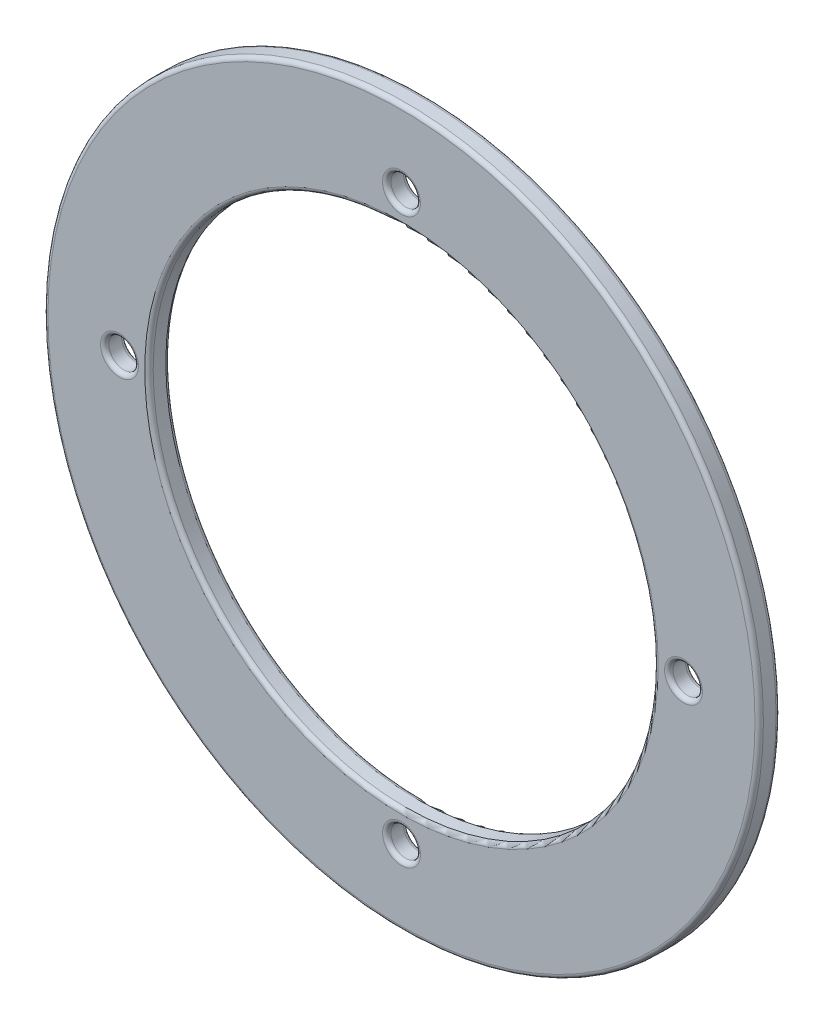
ISO-10303-21;
HEADER;
FILE_DESCRIPTION(('STEP AP214'),'2;1');
FILE_NAME('part.step','',(''),(''),'','','');
FILE_SCHEMA(('AUTOMOTIVE_DESIGN { 1 0 10303 214 1 1 1 1 }'));
ENDSEC;
DATA;
#1=APPLICATION_CONTEXT('core data for automotive mechanical design processes');
#2=APPLICATION_PROTOCOL_DEFINITION('international standard','automotive_design',2000,#1);
#3=PRODUCT_CONTEXT('',#1,'mechanical');
#4=PRODUCT('Part','Part','',(#3));
#5=PRODUCT_RELATED_PRODUCT_CATEGORY('part','',(#4));
#6=PRODUCT_DEFINITION_FORMATION('','',#4);
#7=PRODUCT_DEFINITION_CONTEXT('part definition',#1,'design');
#8=PRODUCT_DEFINITION('design','',#6,#7);
#9=PRODUCT_DEFINITION_SHAPE('','',#8);
#10=(LENGTH_UNIT() NAMED_UNIT(*) SI_UNIT(.MILLI.,.METRE.));
#11=(NAMED_UNIT(*) PLANE_ANGLE_UNIT() SI_UNIT($,.RADIAN.));
#12=(NAMED_UNIT(*) SI_UNIT($,.STERADIAN.) SOLID_ANGLE_UNIT());
#13=UNCERTAINTY_MEASURE_WITH_UNIT(LENGTH_MEASURE(1.E-05),#10,'distance_accuracy_value','');
#14=(GEOMETRIC_REPRESENTATION_CONTEXT(3) GLOBAL_UNCERTAINTY_ASSIGNED_CONTEXT((#13)) GLOBAL_UNIT_ASSIGNED_CONTEXT((#10,
#11,#12)) REPRESENTATION_CONTEXT('',''));
#15=CARTESIAN_POINT('',(0.,0.,0.));
#16=DIRECTION('',(0.,0.,1.));
#17=DIRECTION('',(1.,0.,0.));
#18=AXIS2_PLACEMENT_3D('',#15,#16,#17);
#19=CARTESIAN_POINT('',(0.,0.,2.5));
#20=DIRECTION('',(0.,0.,1.));
#21=DIRECTION('',(1.,0.,0.));
#22=AXIS2_PLACEMENT_3D('',#19,#20,#21);
#23=PLANE('',#22);
#24=CARTESIAN_POINT('',(0.,0.,2.5));
#25=DIRECTION('',(0.,0.,1.));
#26=DIRECTION('',(1.,0.,0.));
#27=AXIS2_PLACEMENT_3D('',#24,#25,#26);
#28=CIRCLE('',#27,30.5);
#29=CARTESIAN_POINT('',(30.5,0.,2.5));
#30=VERTEX_POINT('',#29);
#31=EDGE_CURVE('E87',#30,#30,#28,.F.);
#32=ORIENTED_EDGE('',*,*,#31,.T.);
#33=EDGE_LOOP('',(#32));
#34=FACE_BOUND('',#33,.T.);
#35=CARTESIAN_POINT('',(-33.5,0.,2.5));
#36=DIRECTION('',(0.,0.,1.));
#37=DIRECTION('',(1.,0.,0.));
#38=AXIS2_PLACEMENT_3D('',#35,#36,#37);
#39=CIRCLE('',#38,2.25000000000034);
#40=CARTESIAN_POINT('',(-31.2499999999997,0.,2.5));
#41=VERTEX_POINT('',#40);
#42=EDGE_CURVE('E90',#41,#41,#39,.F.);
#43=ORIENTED_EDGE('',*,*,#42,.T.);
#44=EDGE_LOOP('',(#43));
#45=FACE_BOUND('',#44,.T.);
#46=CARTESIAN_POINT('',(0.,-33.5,2.5));
#47=DIRECTION('',(0.,0.,1.));
#48=DIRECTION('',(1.,0.,0.));
#49=AXIS2_PLACEMENT_3D('',#46,#47,#48);
#50=CIRCLE('',#49,2.25000000000023);
#51=CARTESIAN_POINT('',(2.25000000000023,-33.5,2.5));
#52=VERTEX_POINT('',#51);
#53=EDGE_CURVE('E93',#52,#52,#50,.F.);
#54=ORIENTED_EDGE('',*,*,#53,.T.);
#55=EDGE_LOOP('',(#54));
#56=FACE_BOUND('',#55,.T.);
#57=CARTESIAN_POINT('',(33.5,0.,2.5));
#58=DIRECTION('',(0.,0.,1.));
#59=DIRECTION('',(1.,0.,0.));
#60=AXIS2_PLACEMENT_3D('',#57,#58,#59);
#61=CIRCLE('',#60,2.25000000000011);
#62=CARTESIAN_POINT('',(35.7500000000001,0.,2.5));
#63=VERTEX_POINT('',#62);
#64=EDGE_CURVE('E96',#63,#63,#61,.F.);
#65=ORIENTED_EDGE('',*,*,#64,.T.);
#66=EDGE_LOOP('',(#65));
#67=FACE_BOUND('',#66,.T.);
#68=CARTESIAN_POINT('',(0.,33.5,2.5));
#69=DIRECTION('',(0.,0.,1.));
#70=DIRECTION('',(1.,0.,0.));
#71=AXIS2_PLACEMENT_3D('',#68,#69,#70);
#72=CIRCLE('',#71,2.25);
#73=CARTESIAN_POINT('',(2.25,33.5,2.5));
#74=VERTEX_POINT('',#73);
#75=EDGE_CURVE('E99',#74,#74,#72,.F.);
#76=ORIENTED_EDGE('',*,*,#75,.T.);
#77=EDGE_LOOP('',(#76));
#78=FACE_BOUND('',#77,.T.);
#79=CARTESIAN_POINT('',(0.,0.,2.5));
#80=DIRECTION('',(0.,0.,1.));
#81=DIRECTION('',(1.,0.,0.));
#82=AXIS2_PLACEMENT_3D('',#79,#80,#81);
#83=CIRCLE('',#82,42.);
#84=CARTESIAN_POINT('',(42.,0.,2.5));
#85=VERTEX_POINT('',#84);
#86=EDGE_CURVE('E102',#85,#85,#83,.T.);
#87=ORIENTED_EDGE('',*,*,#86,.T.);
#88=EDGE_LOOP('',(#87));
#89=FACE_BOUND('',#88,.T.);
#90=ADVANCED_FACE('F31',(#34,#45,#56,#67,#78,#89),#23,.T.);
#91=CARTESIAN_POINT('',(0.,0.,0.));
#92=DIRECTION('',(0.,0.,1.));
#93=DIRECTION('',(1.,0.,0.));
#94=AXIS2_PLACEMENT_3D('',#91,#92,#93);
#95=PLANE('',#94);
#96=CARTESIAN_POINT('',(0.,0.,0.));
#97=DIRECTION('',(0.,0.,1.));
#98=DIRECTION('',(1.,0.,0.));
#99=AXIS2_PLACEMENT_3D('',#96,#97,#98);
#100=CIRCLE('',#99,30.5);
#101=CARTESIAN_POINT('',(30.5,0.,0.));
#102=VERTEX_POINT('',#101);
#103=EDGE_CURVE('E69',#102,#102,#100,.T.);
#104=ORIENTED_EDGE('',*,*,#103,.T.);
#105=EDGE_LOOP('',(#104));
#106=FACE_BOUND('',#105,.T.);
#107=CARTESIAN_POINT('',(-33.5,0.,0.));
#108=DIRECTION('',(0.,0.,1.));
#109=DIRECTION('',(1.,0.,0.));
#110=AXIS2_PLACEMENT_3D('',#107,#108,#109);
#111=CIRCLE('',#110,2.25000000000034);
#112=CARTESIAN_POINT('',(-31.2499999999997,0.,0.));
#113=VERTEX_POINT('',#112);
#114=EDGE_CURVE('E72',#113,#113,#111,.T.);
#115=ORIENTED_EDGE('',*,*,#114,.T.);
#116=EDGE_LOOP('',(#115));
#117=FACE_BOUND('',#116,.T.);
#118=CARTESIAN_POINT('',(0.,-33.5,0.));
#119=DIRECTION('',(0.,0.,1.));
#120=DIRECTION('',(1.,0.,0.));
#121=AXIS2_PLACEMENT_3D('',#118,#119,#120);
#122=CIRCLE('',#121,2.25000000000023);
#123=CARTESIAN_POINT('',(2.25000000000023,-33.5,0.));
#124=VERTEX_POINT('',#123);
#125=EDGE_CURVE('E75',#124,#124,#122,.T.);
#126=ORIENTED_EDGE('',*,*,#125,.T.);
#127=EDGE_LOOP('',(#126));
#128=FACE_BOUND('',#127,.T.);
#129=CARTESIAN_POINT('',(33.5,0.,0.));
#130=DIRECTION('',(0.,0.,1.));
#131=DIRECTION('',(1.,0.,0.));
#132=AXIS2_PLACEMENT_3D('',#129,#130,#131);
#133=CIRCLE('',#132,2.25000000000011);
#134=CARTESIAN_POINT('',(35.7500000000001,0.,0.));
#135=VERTEX_POINT('',#134);
#136=EDGE_CURVE('E78',#135,#135,#133,.T.);
#137=ORIENTED_EDGE('',*,*,#136,.T.);
#138=EDGE_LOOP('',(#137));
#139=FACE_BOUND('',#138,.T.);
#140=CARTESIAN_POINT('',(0.,33.5,0.));
#141=DIRECTION('',(0.,0.,1.));
#142=DIRECTION('',(1.,0.,0.));
#143=AXIS2_PLACEMENT_3D('',#140,#141,#142);
#144=CIRCLE('',#143,2.25);
#145=CARTESIAN_POINT('',(2.25,33.5,0.));
#146=VERTEX_POINT('',#145);
#147=EDGE_CURVE('E81',#146,#146,#144,.T.);
#148=ORIENTED_EDGE('',*,*,#147,.T.);
#149=EDGE_LOOP('',(#148));
#150=FACE_BOUND('',#149,.T.);
#151=CARTESIAN_POINT('',(0.,0.,0.));
#152=DIRECTION('',(0.,0.,1.));
#153=DIRECTION('',(1.,0.,0.));
#154=AXIS2_PLACEMENT_3D('',#151,#152,#153);
#155=CIRCLE('',#154,42.);
#156=CARTESIAN_POINT('',(42.,0.,0.));
#157=VERTEX_POINT('',#156);
#158=EDGE_CURVE('E84',#157,#157,#155,.F.);
#159=ORIENTED_EDGE('',*,*,#158,.T.);
#160=EDGE_LOOP('',(#159));
#161=FACE_BOUND('',#160,.T.);
#162=ADVANCED_FACE('F131',(#106,#117,#128,#139,#150,#161),#95,.F.);
#163=CARTESIAN_POINT('',(0.,0.,2.5));
#164=DIRECTION('',(0.,0.,-1.));
#165=DIRECTION('',(-1.,0.,0.));
#166=AXIS2_PLACEMENT_3D('',#163,#164,#165);
#167=CYLINDRICAL_SURFACE('',#166,42.5);
#168=CARTESIAN_POINT('',(0.,0.,2.));
#169=DIRECTION('',(0.,0.,1.));
#170=DIRECTION('',(1.,0.,0.));
#171=AXIS2_PLACEMENT_3D('',#168,#169,#170);
#172=CIRCLE('',#171,42.5);
#173=CARTESIAN_POINT('',(42.5,0.,2.));
#174=VERTEX_POINT('',#173);
#175=EDGE_CURVE('E10',#174,#174,#172,.F.);
#176=ORIENTED_EDGE('',*,*,#175,.T.);
#177=EDGE_LOOP('',(#176));
#178=FACE_BOUND('',#177,.T.);
#179=CARTESIAN_POINT('',(0.,0.,0.5));
#180=DIRECTION('',(0.,0.,1.));
#181=DIRECTION('',(1.,0.,0.));
#182=AXIS2_PLACEMENT_3D('',#179,#180,#181);
#183=CIRCLE('',#182,42.5);
#184=CARTESIAN_POINT('',(42.5,0.,0.5));
#185=VERTEX_POINT('',#184);
#186=EDGE_CURVE('E38',#185,#185,#183,.T.);
#187=ORIENTED_EDGE('',*,*,#186,.T.);
#188=EDGE_LOOP('',(#187));
#189=FACE_BOUND('',#188,.T.);
#190=ADVANCED_FACE('F137',(#178,#189),#167,.T.);
#191=CARTESIAN_POINT('',(0.,33.5,2.5));
#192=DIRECTION('',(0.,0.,-1.));
#193=DIRECTION('',(-1.,0.,0.));
#194=AXIS2_PLACEMENT_3D('',#191,#192,#193);
#195=CYLINDRICAL_SURFACE('',#194,1.75);
#196=CARTESIAN_POINT('',(0.,33.5,0.5));
#197=DIRECTION('',(0.,0.,1.));
#198=DIRECTION('',(1.,0.,0.));
#199=AXIS2_PLACEMENT_3D('',#196,#197,#198);
#200=CIRCLE('',#199,1.75);
#201=CARTESIAN_POINT('',(1.75,33.5,0.5));
#202=VERTEX_POINT('',#201);
#203=EDGE_CURVE('E42',#202,#202,#200,.F.);
#204=ORIENTED_EDGE('',*,*,#203,.T.);
#205=EDGE_LOOP('',(#204));
#206=FACE_BOUND('',#205,.T.);
#207=CARTESIAN_POINT('',(0.,33.5,2.));
#208=DIRECTION('',(0.,0.,1.));
#209=DIRECTION('',(1.,0.,0.));
#210=AXIS2_PLACEMENT_3D('',#207,#208,#209);
#211=CIRCLE('',#210,1.75);
#212=CARTESIAN_POINT('',(1.75,33.5,2.));
#213=VERTEX_POINT('',#212);
#214=EDGE_CURVE('E46',#213,#213,#211,.T.);
#215=ORIENTED_EDGE('',*,*,#214,.T.);
#216=EDGE_LOOP('',(#215));
#217=FACE_BOUND('',#216,.T.);
#218=ADVANCED_FACE('F142',(#206,#217),#195,.F.);
#219=CARTESIAN_POINT('',(33.5,0.,2.5));
#220=DIRECTION('',(0.,0.,-1.));
#221=DIRECTION('',(-1.,0.,0.));
#222=AXIS2_PLACEMENT_3D('',#219,#220,#221);
#223=CYLINDRICAL_SURFACE('',#222,1.75000000000011);
#224=CARTESIAN_POINT('',(33.5,0.,0.5));
#225=DIRECTION('',(0.,0.,1.));
#226=DIRECTION('',(1.,0.,0.));
#227=AXIS2_PLACEMENT_3D('',#224,#225,#226);
#228=CIRCLE('',#227,1.75000000000011);
#229=CARTESIAN_POINT('',(35.2500000000001,0.,0.5));
#230=VERTEX_POINT('',#229);
#231=EDGE_CURVE('E51',#230,#230,#228,.F.);
#232=ORIENTED_EDGE('',*,*,#231,.T.);
#233=EDGE_LOOP('',(#232));
#234=FACE_BOUND('',#233,.T.);
#235=CARTESIAN_POINT('',(33.5,0.,2.));
#236=DIRECTION('',(0.,0.,1.));
#237=DIRECTION('',(1.,0.,0.));
#238=AXIS2_PLACEMENT_3D('',#235,#236,#237);
#239=CIRCLE('',#238,1.75000000000011);
#240=CARTESIAN_POINT('',(35.2500000000001,0.,2.));
#241=VERTEX_POINT('',#240);
#242=EDGE_CURVE('E54',#241,#241,#239,.T.);
#243=ORIENTED_EDGE('',*,*,#242,.T.);
#244=EDGE_LOOP('',(#243));
#245=FACE_BOUND('',#244,.T.);
#246=ADVANCED_FACE('F149',(#234,#245),#223,.F.);
#247=CARTESIAN_POINT('',(0.,-33.5,2.5));
#248=DIRECTION('',(0.,0.,-1.));
#249=DIRECTION('',(-1.,0.,0.));
#250=AXIS2_PLACEMENT_3D('',#247,#248,#249);
#251=CYLINDRICAL_SURFACE('',#250,1.75000000000023);
#252=CARTESIAN_POINT('',(0.,-33.5,0.5));
#253=DIRECTION('',(0.,0.,1.));
#254=DIRECTION('',(1.,0.,0.));
#255=AXIS2_PLACEMENT_3D('',#252,#253,#254);
#256=CIRCLE('',#255,1.75000000000023);
#257=CARTESIAN_POINT('',(1.75000000000023,-33.5,0.5));
#258=VERTEX_POINT('',#257);
#259=EDGE_CURVE('E57',#258,#258,#256,.F.);
#260=ORIENTED_EDGE('',*,*,#259,.T.);
#261=EDGE_LOOP('',(#260));
#262=FACE_BOUND('',#261,.T.);
#263=CARTESIAN_POINT('',(0.,-33.5,2.));
#264=DIRECTION('',(0.,0.,1.));
#265=DIRECTION('',(1.,0.,0.));
#266=AXIS2_PLACEMENT_3D('',#263,#264,#265);
#267=CIRCLE('',#266,1.75000000000023);
#268=CARTESIAN_POINT('',(1.75000000000023,-33.5,2.));
#269=VERTEX_POINT('',#268);
#270=EDGE_CURVE('E60',#269,#269,#267,.T.);
#271=ORIENTED_EDGE('',*,*,#270,.T.);
#272=EDGE_LOOP('',(#271));
#273=FACE_BOUND('',#272,.T.);
#274=ADVANCED_FACE('F154',(#262,#273),#251,.F.);
#275=CARTESIAN_POINT('',(-33.5,0.,2.5));
#276=DIRECTION('',(0.,0.,-1.));
#277=DIRECTION('',(-1.,0.,0.));
#278=AXIS2_PLACEMENT_3D('',#275,#276,#277);
#279=CYLINDRICAL_SURFACE('',#278,1.75000000000034);
#280=CARTESIAN_POINT('',(-33.5,0.,0.5));
#281=DIRECTION('',(0.,0.,1.));
#282=DIRECTION('',(1.,0.,0.));
#283=AXIS2_PLACEMENT_3D('',#280,#281,#282);
#284=CIRCLE('',#283,1.75000000000034);
#285=CARTESIAN_POINT('',(-31.7499999999997,0.,0.5));
#286=VERTEX_POINT('',#285);
#287=EDGE_CURVE('E63',#286,#286,#284,.F.);
#288=ORIENTED_EDGE('',*,*,#287,.T.);
#289=EDGE_LOOP('',(#288));
#290=FACE_BOUND('',#289,.T.);
#291=CARTESIAN_POINT('',(-33.5,0.,2.));
#292=DIRECTION('',(0.,0.,1.));
#293=DIRECTION('',(1.,0.,0.));
#294=AXIS2_PLACEMENT_3D('',#291,#292,#293);
#295=CIRCLE('',#294,1.75000000000034);
#296=CARTESIAN_POINT('',(-31.7499999999997,0.,2.));
#297=VERTEX_POINT('',#296);
#298=EDGE_CURVE('E66',#297,#297,#295,.T.);
#299=ORIENTED_EDGE('',*,*,#298,.T.);
#300=EDGE_LOOP('',(#299));
#301=FACE_BOUND('',#300,.T.);
#302=ADVANCED_FACE('F199',(#290,#301),#279,.F.);
#303=CARTESIAN_POINT('',(0.,0.,2.5));
#304=DIRECTION('',(0.,0.,-1.));
#305=DIRECTION('',(-1.,0.,0.));
#306=AXIS2_PLACEMENT_3D('',#303,#304,#305);
#307=CYLINDRICAL_SURFACE('',#306,30.);
#308=CARTESIAN_POINT('',(0.,0.,2.));
#309=DIRECTION('',(0.,0.,1.));
#310=DIRECTION('',(1.,0.,0.));
#311=AXIS2_PLACEMENT_3D('',#308,#309,#310);
#312=CIRCLE('',#311,30.);
#313=CARTESIAN_POINT('',(30.,0.,2.));
#314=VERTEX_POINT('',#313);
#315=EDGE_CURVE('E105',#314,#314,#312,.T.);
#316=ORIENTED_EDGE('',*,*,#315,.T.);
#317=EDGE_LOOP('',(#316));
#318=FACE_BOUND('',#317,.T.);
#319=CARTESIAN_POINT('',(0.,0.,0.5));
#320=DIRECTION('',(0.,0.,1.));
#321=DIRECTION('',(1.,0.,0.));
#322=AXIS2_PLACEMENT_3D('',#319,#320,#321);
#323=CIRCLE('',#322,30.);
#324=CARTESIAN_POINT('',(30.,0.,0.5));
#325=VERTEX_POINT('',#324);
#326=EDGE_CURVE('E108',#325,#325,#323,.F.);
#327=ORIENTED_EDGE('',*,*,#326,.T.);
#328=EDGE_LOOP('',(#327));
#329=FACE_BOUND('',#328,.T.);
#330=ADVANCED_FACE('F112',(#318,#329),#307,.F.);
#331=CARTESIAN_POINT('',(0.,0.,2.));
#332=DIRECTION('',(0.,0.,1.));
#333=DIRECTION('',(1.,0.,0.));
#334=AXIS2_PLACEMENT_3D('',#331,#332,#333);
#335=TOROIDAL_SURFACE('',#334,30.5,0.5);
#336=ORIENTED_EDGE('',*,*,#31,.F.);
#337=EDGE_LOOP('',(#336));
#338=FACE_BOUND('',#337,.T.);
#339=ORIENTED_EDGE('',*,*,#315,.F.);
#340=EDGE_LOOP('',(#339));
#341=FACE_BOUND('',#340,.T.);
#342=ADVANCED_FACE('F117',(#338,#341),#335,.T.);
#343=CARTESIAN_POINT('',(0.,0.,0.5));
#344=DIRECTION('',(0.,0.,1.));
#345=DIRECTION('',(1.,0.,0.));
#346=AXIS2_PLACEMENT_3D('',#343,#344,#345);
#347=TOROIDAL_SURFACE('',#346,30.5,0.5);
#348=ORIENTED_EDGE('',*,*,#103,.F.);
#349=EDGE_LOOP('',(#348));
#350=FACE_BOUND('',#349,.T.);
#351=ORIENTED_EDGE('',*,*,#326,.F.);
#352=EDGE_LOOP('',(#351));
#353=FACE_BOUND('',#352,.T.);
#354=ADVANCED_FACE('F114',(#350,#353),#347,.T.);
#355=CARTESIAN_POINT('',(-33.5,0.,0.5));
#356=DIRECTION('',(0.,0.,1.));
#357=DIRECTION('',(1.,0.,0.));
#358=AXIS2_PLACEMENT_3D('',#355,#356,#357);
#359=TOROIDAL_SURFACE('',#358,2.25000000000034,0.5);
#360=ORIENTED_EDGE('',*,*,#287,.F.);
#361=EDGE_LOOP('',(#360));
#362=FACE_BOUND('',#361,.T.);
#363=ORIENTED_EDGE('',*,*,#114,.F.);
#364=EDGE_LOOP('',(#363));
#365=FACE_BOUND('',#364,.T.);
#366=ADVANCED_FACE('F116',(#362,#365),#359,.T.);
#367=CARTESIAN_POINT('',(-33.5,0.,2.));
#368=DIRECTION('',(0.,0.,1.));
#369=DIRECTION('',(1.,0.,0.));
#370=AXIS2_PLACEMENT_3D('',#367,#368,#369);
#371=TOROIDAL_SURFACE('',#370,2.25000000000034,0.5);
#372=ORIENTED_EDGE('',*,*,#42,.F.);
#373=EDGE_LOOP('',(#372));
#374=FACE_BOUND('',#373,.T.);
#375=ORIENTED_EDGE('',*,*,#298,.F.);
#376=EDGE_LOOP('',(#375));
#377=FACE_BOUND('',#376,.T.);
#378=ADVANCED_FACE('F124',(#374,#377),#371,.T.);
#379=CARTESIAN_POINT('',(0.,-33.5,0.5));
#380=DIRECTION('',(0.,0.,1.));
#381=DIRECTION('',(1.,0.,0.));
#382=AXIS2_PLACEMENT_3D('',#379,#380,#381);
#383=TOROIDAL_SURFACE('',#382,2.25000000000023,0.5);
#384=ORIENTED_EDGE('',*,*,#259,.F.);
#385=EDGE_LOOP('',(#384));
#386=FACE_BOUND('',#385,.T.);
#387=ORIENTED_EDGE('',*,*,#125,.F.);
#388=EDGE_LOOP('',(#387));
#389=FACE_BOUND('',#388,.T.);
#390=ADVANCED_FACE('F186',(#386,#389),#383,.T.);
#391=CARTESIAN_POINT('',(0.,-33.5,2.));
#392=DIRECTION('',(0.,0.,1.));
#393=DIRECTION('',(1.,0.,0.));
#394=AXIS2_PLACEMENT_3D('',#391,#392,#393);
#395=TOROIDAL_SURFACE('',#394,2.25000000000023,0.5);
#396=ORIENTED_EDGE('',*,*,#53,.F.);
#397=EDGE_LOOP('',(#396));
#398=FACE_BOUND('',#397,.T.);
#399=ORIENTED_EDGE('',*,*,#270,.F.);
#400=EDGE_LOOP('',(#399));
#401=FACE_BOUND('',#400,.T.);
#402=ADVANCED_FACE('F182',(#398,#401),#395,.T.);
#403=CARTESIAN_POINT('',(33.5,0.,0.5));
#404=DIRECTION('',(0.,0.,1.));
#405=DIRECTION('',(1.,0.,0.));
#406=AXIS2_PLACEMENT_3D('',#403,#404,#405);
#407=TOROIDAL_SURFACE('',#406,2.25000000000011,0.5);
#408=ORIENTED_EDGE('',*,*,#231,.F.);
#409=EDGE_LOOP('',(#408));
#410=FACE_BOUND('',#409,.T.);
#411=ORIENTED_EDGE('',*,*,#136,.F.);
#412=EDGE_LOOP('',(#411));
#413=FACE_BOUND('',#412,.T.);
#414=ADVANCED_FACE('F178',(#410,#413),#407,.T.);
#415=CARTESIAN_POINT('',(33.5,0.,2.));
#416=DIRECTION('',(0.,0.,1.));
#417=DIRECTION('',(1.,0.,0.));
#418=AXIS2_PLACEMENT_3D('',#415,#416,#417);
#419=TOROIDAL_SURFACE('',#418,2.25000000000011,0.5);
#420=ORIENTED_EDGE('',*,*,#64,.F.);
#421=EDGE_LOOP('',(#420));
#422=FACE_BOUND('',#421,.T.);
#423=ORIENTED_EDGE('',*,*,#242,.F.);
#424=EDGE_LOOP('',(#423));
#425=FACE_BOUND('',#424,.T.);
#426=ADVANCED_FACE('F171',(#422,#425),#419,.T.);
#427=CARTESIAN_POINT('',(0.,33.5,0.5));
#428=DIRECTION('',(0.,0.,1.));
#429=DIRECTION('',(1.,0.,0.));
#430=AXIS2_PLACEMENT_3D('',#427,#428,#429);
#431=TOROIDAL_SURFACE('',#430,2.25,0.5);
#432=ORIENTED_EDGE('',*,*,#203,.F.);
#433=EDGE_LOOP('',(#432));
#434=FACE_BOUND('',#433,.T.);
#435=ORIENTED_EDGE('',*,*,#147,.F.);
#436=EDGE_LOOP('',(#435));
#437=FACE_BOUND('',#436,.T.);
#438=ADVANCED_FACE('F163',(#434,#437),#431,.T.);
#439=CARTESIAN_POINT('',(0.,33.5,2.));
#440=DIRECTION('',(0.,0.,1.));
#441=DIRECTION('',(1.,0.,0.));
#442=AXIS2_PLACEMENT_3D('',#439,#440,#441);
#443=TOROIDAL_SURFACE('',#442,2.25,0.5);
#444=ORIENTED_EDGE('',*,*,#75,.F.);
#445=EDGE_LOOP('',(#444));
#446=FACE_BOUND('',#445,.T.);
#447=ORIENTED_EDGE('',*,*,#214,.F.);
#448=EDGE_LOOP('',(#447));
#449=FACE_BOUND('',#448,.T.);
#450=ADVANCED_FACE('F160',(#446,#449),#443,.T.);
#451=CARTESIAN_POINT('',(0.,0.,2.));
#452=DIRECTION('',(0.,0.,1.));
#453=DIRECTION('',(1.,0.,0.));
#454=AXIS2_PLACEMENT_3D('',#451,#452,#453);
#455=TOROIDAL_SURFACE('',#454,42.,0.5);
#456=ORIENTED_EDGE('',*,*,#175,.F.);
#457=EDGE_LOOP('',(#456));
#458=FACE_BOUND('',#457,.T.);
#459=ORIENTED_EDGE('',*,*,#86,.F.);
#460=EDGE_LOOP('',(#459));
#461=FACE_BOUND('',#460,.T.);
#462=ADVANCED_FACE('F162',(#458,#461),#455,.T.);
#463=CARTESIAN_POINT('',(0.,0.,0.5));
#464=DIRECTION('',(0.,0.,1.));
#465=DIRECTION('',(1.,0.,0.));
#466=AXIS2_PLACEMENT_3D('',#463,#464,#465);
#467=TOROIDAL_SURFACE('',#466,42.,0.5);
#468=ORIENTED_EDGE('',*,*,#158,.F.);
#469=EDGE_LOOP('',(#468));
#470=FACE_BOUND('',#469,.T.);
#471=ORIENTED_EDGE('',*,*,#186,.F.);
#472=EDGE_LOOP('',(#471));
#473=FACE_BOUND('',#472,.T.);
#474=ADVANCED_FACE('F33',(#470,#473),#467,.T.);
#475=CLOSED_SHELL('',(#90,#162,#190,#218,#246,#274,#302,#330,#342,#354,#366,#378,#390,#402,#414,
#426,#438,#450,#462,#474));
#476=MANIFOLD_SOLID_BREP('B2',#475);
#477=ADVANCED_BREP_SHAPE_REPRESENTATION('',(#18,#476),#14);
#478=SHAPE_DEFINITION_REPRESENTATION(#9,#477);
ENDSEC;
END-ISO-10303-21;
